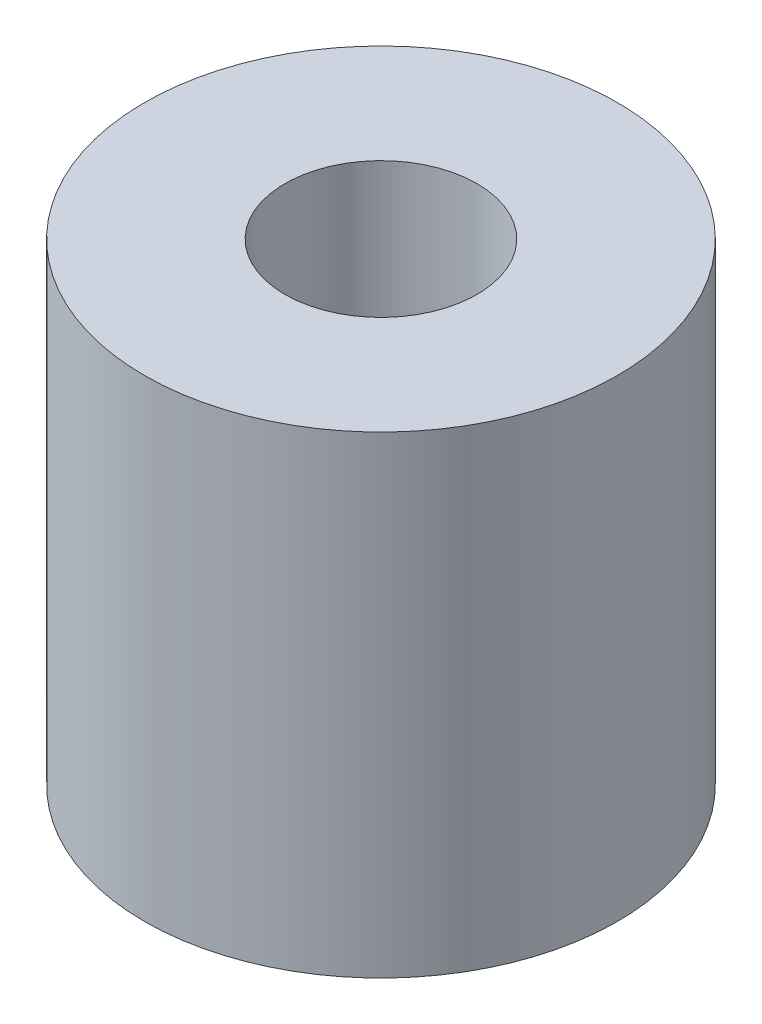
ISO-10303-21;
HEADER;
FILE_DESCRIPTION(('STEP AP214'),'2;1');
FILE_NAME('part.step','',(''),(''),'','','');
FILE_SCHEMA(('AUTOMOTIVE_DESIGN { 1 0 10303 214 1 1 1 1 }'));
ENDSEC;
DATA;
#1=APPLICATION_CONTEXT('core data for automotive mechanical design processes');
#2=APPLICATION_PROTOCOL_DEFINITION('international standard','automotive_design',2000,#1);
#3=PRODUCT_CONTEXT('',#1,'mechanical');
#4=PRODUCT('Part','Part','',(#3));
#5=PRODUCT_RELATED_PRODUCT_CATEGORY('part','',(#4));
#6=PRODUCT_DEFINITION_FORMATION('','',#4);
#7=PRODUCT_DEFINITION_CONTEXT('part definition',#1,'design');
#8=PRODUCT_DEFINITION('design','',#6,#7);
#9=PRODUCT_DEFINITION_SHAPE('','',#8);
#10=(LENGTH_UNIT() NAMED_UNIT(*) SI_UNIT(.MILLI.,.METRE.));
#11=(NAMED_UNIT(*) PLANE_ANGLE_UNIT() SI_UNIT($,.RADIAN.));
#12=(NAMED_UNIT(*) SI_UNIT($,.STERADIAN.) SOLID_ANGLE_UNIT());
#13=UNCERTAINTY_MEASURE_WITH_UNIT(LENGTH_MEASURE(1.E-05),#10,'distance_accuracy_value','');
#14=(GEOMETRIC_REPRESENTATION_CONTEXT(3) GLOBAL_UNCERTAINTY_ASSIGNED_CONTEXT((#13)) GLOBAL_UNIT_ASSIGNED_CONTEXT((#10,
#11,#12)) REPRESENTATION_CONTEXT('',''));
#15=CARTESIAN_POINT('',(0.,0.,0.));
#16=DIRECTION('',(0.,0.,1.));
#17=DIRECTION('',(1.,0.,0.));
#18=AXIS2_PLACEMENT_3D('',#15,#16,#17);
#19=CARTESIAN_POINT('',(0.,4.,0.));
#20=DIRECTION('',(0.,1.,0.));
#21=DIRECTION('',(0.,0.,1.));
#22=AXIS2_PLACEMENT_3D('',#19,#20,#21);
#23=PLANE('',#22);
#24=CARTESIAN_POINT('',(0.,4.,0.));
#25=DIRECTION('',(0.,1.,0.));
#26=DIRECTION('',(0.,0.,1.));
#27=AXIS2_PLACEMENT_3D('',#24,#25,#26);
#28=CIRCLE('',#27,4.);
#29=CARTESIAN_POINT('',(0.,4.,4.));
#30=VERTEX_POINT('',#29);
#31=EDGE_CURVE('E10',#30,#30,#28,.T.);
#32=ORIENTED_EDGE('',*,*,#31,.T.);
#33=EDGE_LOOP('',(#32));
#34=FACE_BOUND('',#33,.T.);
#35=CARTESIAN_POINT('',(0.,4.,0.));
#36=DIRECTION('',(0.,1.,0.));
#37=DIRECTION('',(0.,0.,1.));
#38=AXIS2_PLACEMENT_3D('',#35,#36,#37);
#39=CIRCLE('',#38,1.625);
#40=CARTESIAN_POINT('',(0.,4.,1.625));
#41=VERTEX_POINT('',#40);
#42=EDGE_CURVE('E48',#41,#41,#39,.T.);
#43=ORIENTED_EDGE('',*,*,#42,.F.);
#44=EDGE_LOOP('',(#43));
#45=FACE_BOUND('',#44,.T.);
#46=ADVANCED_FACE('F37',(#34,#45),#23,.T.);
#47=CARTESIAN_POINT('',(0.,-4.,0.));
#48=DIRECTION('',(0.,1.,0.));
#49=DIRECTION('',(0.,0.,1.));
#50=AXIS2_PLACEMENT_3D('',#47,#48,#49);
#51=PLANE('',#50);
#52=CARTESIAN_POINT('',(0.,-4.,0.));
#53=DIRECTION('',(0.,1.,0.));
#54=DIRECTION('',(0.,0.,1.));
#55=AXIS2_PLACEMENT_3D('',#52,#53,#54);
#56=CIRCLE('',#55,4.);
#57=CARTESIAN_POINT('',(0.,-4.,4.));
#58=VERTEX_POINT('',#57);
#59=EDGE_CURVE('E41',#58,#58,#56,.T.);
#60=ORIENTED_EDGE('',*,*,#59,.F.);
#61=EDGE_LOOP('',(#60));
#62=FACE_BOUND('',#61,.T.);
#63=CARTESIAN_POINT('',(0.,-4.,0.));
#64=DIRECTION('',(0.,1.,0.));
#65=DIRECTION('',(0.,0.,1.));
#66=AXIS2_PLACEMENT_3D('',#63,#64,#65);
#67=CIRCLE('',#66,1.625);
#68=CARTESIAN_POINT('',(0.,-4.,1.625));
#69=VERTEX_POINT('',#68);
#70=EDGE_CURVE('E50',#69,#69,#67,.T.);
#71=ORIENTED_EDGE('',*,*,#70,.T.);
#72=EDGE_LOOP('',(#71));
#73=FACE_BOUND('',#72,.T.);
#74=ADVANCED_FACE('F60',(#62,#73),#51,.F.);
#75=CARTESIAN_POINT('',(0.,4.,0.));
#76=DIRECTION('',(0.,-1.,0.));
#77=DIRECTION('',(0.,0.,-1.));
#78=AXIS2_PLACEMENT_3D('',#75,#76,#77);
#79=CYLINDRICAL_SURFACE('',#78,4.);
#80=ORIENTED_EDGE('',*,*,#31,.F.);
#81=EDGE_LOOP('',(#80));
#82=FACE_BOUND('',#81,.T.);
#83=ORIENTED_EDGE('',*,*,#59,.T.);
#84=EDGE_LOOP('',(#83));
#85=FACE_BOUND('',#84,.T.);
#86=ADVANCED_FACE('F39',(#82,#85),#79,.T.);
#87=CARTESIAN_POINT('',(0.,4.,0.));
#88=DIRECTION('',(0.,-1.,0.));
#89=DIRECTION('',(0.,0.,-1.));
#90=AXIS2_PLACEMENT_3D('',#87,#88,#89);
#91=CYLINDRICAL_SURFACE('',#90,1.625);
#92=ORIENTED_EDGE('',*,*,#42,.T.);
#93=EDGE_LOOP('',(#92));
#94=FACE_BOUND('',#93,.T.);
#95=ORIENTED_EDGE('',*,*,#70,.F.);
#96=EDGE_LOOP('',(#95));
#97=FACE_BOUND('',#96,.T.);
#98=ADVANCED_FACE('F56',(#94,#97),#91,.F.);
#99=CLOSED_SHELL('',(#46,#74,#86,#98));
#100=MANIFOLD_SOLID_BREP('B2',#99);
#101=ADVANCED_BREP_SHAPE_REPRESENTATION('',(#18,#100),#14);
#102=SHAPE_DEFINITION_REPRESENTATION(#9,#101);
ENDSEC;
END-ISO-10303-21;
